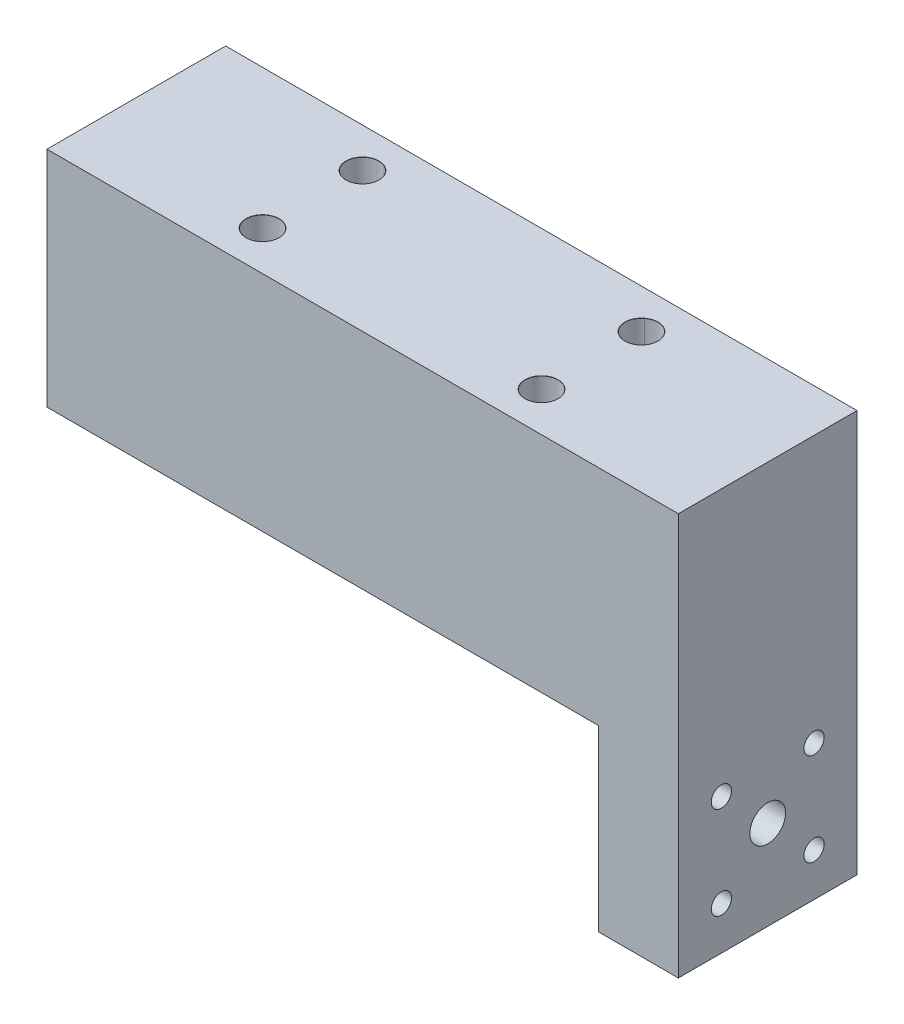
ISO-10303-21;
HEADER;
FILE_DESCRIPTION(('STEP AP214'),'2;1');
FILE_NAME('part.step','',(''),(''),'','','');
FILE_SCHEMA(('AUTOMOTIVE_DESIGN { 1 0 10303 214 1 1 1 1 }'));
ENDSEC;
DATA;
#1=APPLICATION_CONTEXT('core data for automotive mechanical design processes');
#2=APPLICATION_PROTOCOL_DEFINITION('international standard','automotive_design',2000,#1);
#3=PRODUCT_CONTEXT('',#1,'mechanical');
#4=PRODUCT('Part','Part','',(#3));
#5=PRODUCT_RELATED_PRODUCT_CATEGORY('part','',(#4));
#6=PRODUCT_DEFINITION_FORMATION('','',#4);
#7=PRODUCT_DEFINITION_CONTEXT('part definition',#1,'design');
#8=PRODUCT_DEFINITION('design','',#6,#7);
#9=PRODUCT_DEFINITION_SHAPE('','',#8);
#10=(LENGTH_UNIT() NAMED_UNIT(*) SI_UNIT(.MILLI.,.METRE.));
#11=(NAMED_UNIT(*) PLANE_ANGLE_UNIT() SI_UNIT($,.RADIAN.));
#12=(NAMED_UNIT(*) SI_UNIT($,.STERADIAN.) SOLID_ANGLE_UNIT());
#13=UNCERTAINTY_MEASURE_WITH_UNIT(LENGTH_MEASURE(1.E-05),#10,'distance_accuracy_value','');
#14=(GEOMETRIC_REPRESENTATION_CONTEXT(3) GLOBAL_UNCERTAINTY_ASSIGNED_CONTEXT((#13)) GLOBAL_UNIT_ASSIGNED_CONTEXT((#10,
#11,#12)) REPRESENTATION_CONTEXT('',''));
#15=CARTESIAN_POINT('',(0.,0.,0.));
#16=DIRECTION('',(0.,0.,1.));
#17=DIRECTION('',(1.,0.,0.));
#18=AXIS2_PLACEMENT_3D('',#15,#16,#17);
#19=CARTESIAN_POINT('',(15.7940014178421,-24.5903236205962,15.));
#20=DIRECTION('',(1.,0.,0.));
#21=DIRECTION('',(0.,1.,0.));
#22=AXIS2_PLACEMENT_3D('',#19,#20,#21);
#23=CYLINDRICAL_SURFACE('',#22,3.);
#24=CARTESIAN_POINT('',(45.7940014178421,-24.5903236205962,15.));
#25=DIRECTION('',(1.,0.,0.));
#26=DIRECTION('',(0.,1.,0.));
#27=AXIS2_PLACEMENT_3D('',#24,#25,#26);
#28=CIRCLE('',#27,3.);
#29=CARTESIAN_POINT('',(45.7940014178421,-21.5903236205962,15.));
#30=VERTEX_POINT('',#29);
#31=EDGE_CURVE('E270',#30,#30,#28,.T.);
#32=ORIENTED_EDGE('',*,*,#31,.T.);
#33=EDGE_LOOP('',(#32));
#34=FACE_BOUND('',#33,.T.);
#35=CARTESIAN_POINT('',(34.3940014178421,-24.5903236205962,15.));
#36=DIRECTION('',(-1.,0.,0.));
#37=DIRECTION('',(0.,0.,1.));
#38=AXIS2_PLACEMENT_3D('',#35,#36,#37);
#39=CIRCLE('',#38,3.);
#40=CARTESIAN_POINT('',(34.3940014178421,-24.5903236205962,18.));
#41=VERTEX_POINT('',#40);
#42=EDGE_CURVE('E169',#41,#41,#39,.F.);
#43=ORIENTED_EDGE('',*,*,#42,.F.);
#44=EDGE_LOOP('',(#43));
#45=FACE_BOUND('',#44,.T.);
#46=ADVANCED_FACE('F43',(#34,#45),#23,.F.);
#47=CARTESIAN_POINT('',(-60.2059985821579,27.9096763794038,30.));
#48=DIRECTION('',(1.,0.,0.));
#49=DIRECTION('',(0.,1.,0.));
#50=AXIS2_PLACEMENT_3D('',#47,#48,#49);
#51=PLANE('',#50);
#52=DIRECTION('',(0.,0.,-1.));
#53=VECTOR('',#52,1.);
#54=CARTESIAN_POINT('',(-60.2059985821578,-9.59032362059618,30.));
#55=LINE('',#54,#53);
#56=CARTESIAN_POINT('',(-60.2059985821578,-9.59032362059618,30.));
#57=VERTEX_POINT('',#56);
#58=CARTESIAN_POINT('',(-60.2059985821578,-9.59032362059618,0.));
#59=VERTEX_POINT('',#58);
#60=EDGE_CURVE('E262',#57,#59,#55,.T.);
#61=ORIENTED_EDGE('',*,*,#60,.F.);
#62=DIRECTION('',(0.,-1.,0.));
#63=VECTOR('',#62,1.);
#64=CARTESIAN_POINT('',(-60.2059985821579,27.9096763794038,30.));
#65=LINE('',#64,#63);
#66=CARTESIAN_POINT('',(-60.2059985821579,27.9096763794038,30.));
#67=VERTEX_POINT('',#66);
#68=EDGE_CURVE('E136',#67,#57,#65,.T.);
#69=ORIENTED_EDGE('',*,*,#68,.F.);
#70=DIRECTION('',(0.,0.,-1.));
#71=VECTOR('',#70,1.);
#72=CARTESIAN_POINT('',(-60.2059985821579,27.9096763794038,30.));
#73=LINE('',#72,#71);
#74=CARTESIAN_POINT('',(-60.2059985821579,27.9096763794038,0.));
#75=VERTEX_POINT('',#74);
#76=EDGE_CURVE('E135',#67,#75,#73,.T.);
#77=ORIENTED_EDGE('',*,*,#76,.T.);
#78=DIRECTION('',(0.,-1.,0.));
#79=VECTOR('',#78,1.);
#80=CARTESIAN_POINT('',(-60.2059985821579,27.9096763794038,0.));
#81=LINE('',#80,#79);
#82=EDGE_CURVE('E143',#75,#59,#81,.T.);
#83=ORIENTED_EDGE('',*,*,#82,.T.);
#84=EDGE_LOOP('',(#61,#69,#77,#83));
#85=FACE_BOUND('',#84,.T.);
#86=ADVANCED_FACE('F44',(#85),#51,.F.);
#87=CARTESIAN_POINT('',(-60.2059985821578,-39.5903236205962,30.));
#88=DIRECTION('',(0.,1.,0.));
#89=DIRECTION('',(0.,0.,1.));
#90=AXIS2_PLACEMENT_3D('',#87,#88,#89);
#91=PLANE('',#90);
#92=DIRECTION('',(1.,0.,0.));
#93=VECTOR('',#92,1.);
#94=CARTESIAN_POINT('',(-60.2059985821578,-39.5903236205962,30.));
#95=LINE('',#94,#93);
#96=CARTESIAN_POINT('',(32.3940014178421,-39.5903236205962,30.));
#97=VERTEX_POINT('',#96);
#98=CARTESIAN_POINT('',(45.7940014178422,-39.5903236205962,30.));
#99=VERTEX_POINT('',#98);
#100=EDGE_CURVE('E248',#97,#99,#95,.T.);
#101=ORIENTED_EDGE('',*,*,#100,.F.);
#102=DIRECTION('',(0.,0.,-1.));
#103=VECTOR('',#102,1.);
#104=CARTESIAN_POINT('',(32.3940014178421,-39.5903236205962,30.));
#105=LINE('',#104,#103);
#106=CARTESIAN_POINT('',(32.3940014178421,-39.5903236205962,0.));
#107=VERTEX_POINT('',#106);
#108=EDGE_CURVE('E153',#97,#107,#105,.T.);
#109=ORIENTED_EDGE('',*,*,#108,.T.);
#110=DIRECTION('',(1.,0.,0.));
#111=VECTOR('',#110,1.);
#112=CARTESIAN_POINT('',(-60.2059985821578,-39.5903236205962,0.));
#113=LINE('',#112,#111);
#114=CARTESIAN_POINT('',(45.7940014178422,-39.5903236205962,0.));
#115=VERTEX_POINT('',#114);
#116=EDGE_CURVE('E152',#107,#115,#113,.T.);
#117=ORIENTED_EDGE('',*,*,#116,.T.);
#118=DIRECTION('',(0.,0.,-1.));
#119=VECTOR('',#118,1.);
#120=CARTESIAN_POINT('',(45.7940014178422,-39.5903236205962,30.));
#121=LINE('',#120,#119);
#122=EDGE_CURVE('E164',#99,#115,#121,.T.);
#123=ORIENTED_EDGE('',*,*,#122,.F.);
#124=EDGE_LOOP('',(#101,#109,#117,#123));
#125=FACE_BOUND('',#124,.T.);
#126=ADVANCED_FACE('F213',(#125),#91,.F.);
#127=CARTESIAN_POINT('',(45.7940014178421,27.9096763794038,30.));
#128=DIRECTION('',(-1.,0.,0.));
#129=DIRECTION('',(0.,-1.,0.));
#130=AXIS2_PLACEMENT_3D('',#127,#128,#129);
#131=PLANE('',#130);
#132=CARTESIAN_POINT('',(45.7940014178422,-16.8121490275442,7.22182540694798));
#133=DIRECTION('',(-1.,0.,0.));
#134=DIRECTION('',(0.,0.,1.));
#135=AXIS2_PLACEMENT_3D('',#132,#133,#134);
#136=CIRCLE('',#135,1.7);
#137=CARTESIAN_POINT('',(45.7940014178422,-16.8121490275442,8.92182540694797));
#138=VERTEX_POINT('',#137);
#139=EDGE_CURVE('E296',#138,#138,#136,.T.);
#140=ORIENTED_EDGE('',*,*,#139,.T.);
#141=EDGE_LOOP('',(#140));
#142=FACE_BOUND('',#141,.T.);
#143=CARTESIAN_POINT('',(45.7940014178422,-16.8121490275442,22.7781745930521));
#144=DIRECTION('',(-1.,0.,0.));
#145=DIRECTION('',(0.,0.,1.));
#146=AXIS2_PLACEMENT_3D('',#143,#144,#145);
#147=CIRCLE('',#146,1.7);
#148=CARTESIAN_POINT('',(45.7940014178422,-16.8121490275442,24.4781745930521));
#149=VERTEX_POINT('',#148);
#150=EDGE_CURVE('E286',#149,#149,#147,.T.);
#151=ORIENTED_EDGE('',*,*,#150,.T.);
#152=EDGE_LOOP('',(#151));
#153=FACE_BOUND('',#152,.T.);
#154=CARTESIAN_POINT('',(45.7940014178422,-32.3684982136482,22.778174593052));
#155=DIRECTION('',(-1.,0.,0.));
#156=DIRECTION('',(0.,0.,1.));
#157=AXIS2_PLACEMENT_3D('',#154,#155,#156);
#158=CIRCLE('',#157,1.7);
#159=CARTESIAN_POINT('',(45.7940014178422,-32.3684982136482,24.478174593052));
#160=VERTEX_POINT('',#159);
#161=EDGE_CURVE('E279',#160,#160,#158,.T.);
#162=ORIENTED_EDGE('',*,*,#161,.T.);
#163=EDGE_LOOP('',(#162));
#164=FACE_BOUND('',#163,.T.);
#165=CARTESIAN_POINT('',(45.7940014178422,-32.3684982136484,7.22182540694819));
#166=DIRECTION('',(-1.,0.,0.));
#167=DIRECTION('',(0.,0.,1.));
#168=AXIS2_PLACEMENT_3D('',#165,#166,#167);
#169=CIRCLE('',#168,1.7);
#170=CARTESIAN_POINT('',(45.7940014178422,-32.3684982136484,8.92182540694819));
#171=VERTEX_POINT('',#170);
#172=EDGE_CURVE('E272',#171,#171,#169,.T.);
#173=ORIENTED_EDGE('',*,*,#172,.T.);
#174=EDGE_LOOP('',(#173));
#175=FACE_BOUND('',#174,.T.);
#176=ORIENTED_EDGE('',*,*,#31,.F.);
#177=EDGE_LOOP('',(#176));
#178=FACE_BOUND('',#177,.T.);
#179=DIRECTION('',(0.,1.,0.));
#180=VECTOR('',#179,1.);
#181=CARTESIAN_POINT('',(45.7940014178421,27.9096763794038,0.));
#182=LINE('',#181,#180);
#183=CARTESIAN_POINT('',(45.7940014178421,27.9096763794038,0.));
#184=VERTEX_POINT('',#183);
#185=EDGE_CURVE('E138',#115,#184,#182,.T.);
#186=ORIENTED_EDGE('',*,*,#185,.T.);
#187=DIRECTION('',(0.,0.,-1.));
#188=VECTOR('',#187,1.);
#189=CARTESIAN_POINT('',(45.7940014178421,27.9096763794038,30.));
#190=LINE('',#189,#188);
#191=CARTESIAN_POINT('',(45.7940014178421,27.9096763794038,30.));
#192=VERTEX_POINT('',#191);
#193=EDGE_CURVE('E134',#192,#184,#190,.T.);
#194=ORIENTED_EDGE('',*,*,#193,.F.);
#195=DIRECTION('',(0.,1.,0.));
#196=VECTOR('',#195,1.);
#197=CARTESIAN_POINT('',(45.7940014178421,27.9096763794038,30.));
#198=LINE('',#197,#196);
#199=EDGE_CURVE('E257',#99,#192,#198,.T.);
#200=ORIENTED_EDGE('',*,*,#199,.F.);
#201=ORIENTED_EDGE('',*,*,#122,.T.);
#202=EDGE_LOOP('',(#186,#194,#200,#201));
#203=FACE_BOUND('',#202,.T.);
#204=ADVANCED_FACE('F208',(#142,#153,#164,#175,#178,#203),#131,.F.);
#205=CARTESIAN_POINT('',(-60.2059985821579,27.9096763794038,30.));
#206=DIRECTION('',(0.,-1.,0.));
#207=DIRECTION('',(0.,0.,-1.));
#208=AXIS2_PLACEMENT_3D('',#205,#206,#207);
#209=PLANE('',#208);
#210=CARTESIAN_POINT('',(-30.6242090565358,27.9096763794038,6.6141635759869));
#211=DIRECTION('',(0.,1.,0.));
#212=DIRECTION('',(0.,0.,1.));
#213=AXIS2_PLACEMENT_3D('',#210,#211,#212);
#214=CIRCLE('',#213,2.775);
#215=CARTESIAN_POINT('',(-31.7195661816328,27.9096763794038,9.16383370533685));
#216=VERTEX_POINT('',#215);
#217=CARTESIAN_POINT('',(-29.5288811747591,27.9096763794038,4.06448088368921));
#218=VERTEX_POINT('',#217);
#219=EDGE_CURVE('E607',#216,#218,#214,.T.);
#220=ORIENTED_EDGE('',*,*,#219,.F.);
#221=CARTESIAN_POINT('',(-30.6242382992522,27.9096763794038,6.61415101329855));
#222=DIRECTION('',(0.,1.,0.));
#223=DIRECTION('',(0.,0.,1.));
#224=AXIS2_PLACEMENT_3D('',#221,#222,#223);
#225=CIRCLE('',#224,2.775);
#226=EDGE_CURVE('E59',#218,#216,#225,.T.);
#227=ORIENTED_EDGE('',*,*,#226,.F.);
#228=EDGE_LOOP('',(#220,#227));
#229=FACE_BOUND('',#228,.T.);
#230=CARTESIAN_POINT('',(16.2122227726959,27.9096763794038,6.6141620925815));
#231=DIRECTION('',(0.,1.,0.));
#232=DIRECTION('',(0.,0.,1.));
#233=AXIS2_PLACEMENT_3D('',#230,#231,#232);
#234=CIRCLE('',#233,2.775);
#235=CARTESIAN_POINT('',(14.5385075322435,27.9096763794038,4.40072533182294));
#236=VERTEX_POINT('',#235);
#237=CARTESIAN_POINT('',(17.8859515264885,27.9096763794038,8.82758863501017));
#238=VERTEX_POINT('',#237);
#239=EDGE_CURVE('E200',#236,#238,#234,.T.);
#240=ORIENTED_EDGE('',*,*,#239,.F.);
#241=CARTESIAN_POINT('',(14.5385075322435,27.9096763794038,4.40072533182294));
#242=CARTESIAN_POINT('',(14.7562897477303,27.9096763794038,4.23604475663374));
#243=CARTESIAN_POINT('',(15.0024868107985,27.9096763794038,4.11672695901462));
#244=CARTESIAN_POINT('',(15.1246709466571,27.9096763794038,4.0575112160932));
#245=CARTESIAN_POINT('',(15.2531030303617,27.9096763794038,4.01017637552189));
#246=CARTESIAN_POINT('',(15.380502982951,27.9096763794038,3.9632219364856));
#247=CARTESIAN_POINT('',(15.5129562633657,27.9096763794038,3.92870359695053));
#248=CARTESIAN_POINT('',(15.6443450967281,27.9096763794038,3.8944626604715));
#249=CARTESIAN_POINT('',(15.7795439714078,27.9096763794038,3.8730932537429));
#250=CARTESIAN_POINT('',(15.9136563343446,27.9096763794038,3.85189558003651));
#251=CARTESIAN_POINT('',(16.0502987591571,27.9096763794038,3.84388090598367));
#252=CARTESIAN_POINT('',(16.185843071284,27.9096763794038,3.83593064102823));
#253=CARTESIAN_POINT('',(16.3226130998716,27.9096763794038,3.84134788564343));
#254=CARTESIAN_POINT('',(16.4582839902984,27.9096763794038,3.84672159513369));
#255=CARTESIAN_POINT('',(16.5938644474031,27.9096763794038,3.86551858718748));
#256=CARTESIAN_POINT('',(16.7283553262193,27.9096763794038,3.88416451916324));
#257=CARTESIAN_POINT('',(16.8614404928488,27.9096763794038,3.91616023264291));
#258=CARTESIAN_POINT('',(16.9934561343349,27.9096763794038,3.94789881588849));
#259=CARTESIAN_POINT('',(17.1227643226115,27.9096763794038,3.99278511338637));
#260=CARTESIAN_POINT('',(17.2510333390368,27.9096763794038,4.03731068680721));
#261=CARTESIAN_POINT('',(17.3753192355827,27.9096763794038,4.09465528706305));
#262=CARTESIAN_POINT('',(17.4986063214085,27.9096763794038,4.15153904338517));
#263=CARTESIAN_POINT('',(17.616672980444,27.9096763794038,4.2207896844025));
#264=CARTESIAN_POINT('',(17.7337908090184,27.9096763794038,4.28948379982497));
#265=CARTESIAN_POINT('',(17.8445011796684,27.9096763794038,4.3699735574887));
#266=CARTESIAN_POINT('',(17.9543218379078,27.9096763794038,4.4498164675636));
#267=CARTESIAN_POINT('',(18.0566097146325,27.9096763794038,4.54077017849202));
#268=CARTESIAN_POINT('',(18.1580755654546,27.9096763794038,4.63099294936458));
#269=CARTESIAN_POINT('',(18.2509558562614,27.9096763794038,4.7315346761973));
#270=CARTESIAN_POINT('',(18.3430897242488,27.9096763794038,4.83126840987485));
#271=CARTESIAN_POINT('',(18.4256679377021,27.9096763794038,4.94042987707437));
#272=CARTESIAN_POINT('',(18.5075825199002,27.9096763794038,5.04871407945471));
#273=CARTESIAN_POINT('',(18.5790633795684,27.9096763794038,5.16544399833217));
#274=CARTESIAN_POINT('',(18.649969790711,27.9096763794038,5.2812358293059));
#275=CARTESIAN_POINT('',(18.7096648941637,27.9096763794038,5.40441002256201));
#276=CARTESIAN_POINT('',(18.7688802640961,27.9096763794038,5.52659433916277));
#277=CARTESIAN_POINT('',(18.8162147126236,27.9096763794038,5.65502656738088));
#278=CARTESIAN_POINT('',(18.8631687627568,27.9096763794038,5.78242666329515));
#279=CARTESIAN_POINT('',(18.8976866979654,27.9096763794038,5.91488004908792));
#280=CARTESIAN_POINT('',(18.931927233365,27.9096763794038,6.04626898697278));
#281=CARTESIAN_POINT('',(18.9532962273858,27.9096763794038,6.18146792688514));
#282=CARTESIAN_POINT('',(18.9744934917013,27.9096763794038,6.31558035453136));
#283=CARTESIAN_POINT('',(18.9825077486375,27.9096763794038,6.45222280380697));
#284=CARTESIAN_POINT('',(18.9904575998289,27.9096763794038,6.58776714020686));
#285=CARTESIAN_POINT('',(18.9850399377097,27.9096763794038,6.72453715225247));
#286=CARTESIAN_POINT('',(18.9796658140707,27.9096763794038,6.86020802626963));
#287=CARTESIAN_POINT('',(18.9608684081426,27.9096763794038,6.99578842599912));
#288=CARTESIAN_POINT('',(18.9422220656198,27.9096763794038,7.13027924789243));
#289=CARTESIAN_POINT('',(18.9102259458835,27.9096763794038,7.26336431685465));
#290=CARTESIAN_POINT('',(18.8784869596473,27.9096763794038,7.39537986145301));
#291=CARTESIAN_POINT('',(18.833600267422,27.9096763794038,7.52468791271065));
#292=CARTESIAN_POINT('',(18.7890743024457,27.9096763794038,7.6529567932184));
#293=CARTESIAN_POINT('',(18.7317293227954,27.9096763794038,7.77724251471126));
#294=CARTESIAN_POINT('',(18.6748451901299,27.9096763794038,7.90052942688636));
#295=CARTESIAN_POINT('',(18.6055941886989,27.9096763794038,8.01859587453304));
#296=CARTESIAN_POINT('',(18.5368997157628,27.9096763794038,8.13571349341135));
#297=CARTESIAN_POINT('',(18.456409620144,27.9096763794038,8.24642361835688));
#298=CARTESIAN_POINT('',(18.3765663748266,27.9096763794038,8.35624403287101));
#299=CARTESIAN_POINT('',(18.2856123516579,27.9096763794038,8.45853163194546));
#300=CARTESIAN_POINT('',(18.1953892710578,27.9096763794038,8.55999720734469));
#301=CARTESIAN_POINT('',(18.0948472606916,27.9096763794038,8.65287719124484));
#302=CARTESIAN_POINT('',(17.9949103507752,27.9096763794038,8.74519818771437));
#303=CARTESIAN_POINT('',(17.8859515264885,27.9096763794038,8.82758863501017));
#304=B_SPLINE_CURVE_WITH_KNOTS('',2,(#241,#242,#243,#244,#245,#246,#247,#248,#249,#250,#251,
#252,#253,#254,#255,#256,#257,#258,#259,#260,#261,#262,#263,#264,#265,#266,#267,#268,#269,#270,
#271,#272,#273,#274,#275,#276,#277,#278,#279,#280,#281,#282,#283,#284,#285,#286,#287,#288,#289,
#290,#291,#292,#293,#294,#295,#296,#297,#298,#299,#300,#301,#302,#303),.UNSPECIFIED.,.F.,.F.,(3,
2,2,2,2,2,2,2,2,2,2,2,2,2,2,2,2,2,2,2,2,2,2,2,2,2,2,2,2,2,2,3),(0.,0.0625,0.09375,0.125,0.15625,
0.1875,0.21875,0.25,0.28125,0.3125,0.34375,0.375,0.40625,0.4375,0.46875,0.5,0.53125,0.5625,
0.59375,0.625,0.65625,0.6875,0.71875,0.75,0.78125,0.8125,0.84375,0.875,0.90625,0.9375,0.96875,
1.),.UNSPECIFIED.);
#305=EDGE_CURVE('E70',#236,#238,#304,.T.);
#306=ORIENTED_EDGE('',*,*,#305,.T.);
#307=EDGE_LOOP('',(#240,#306));
#308=FACE_BOUND('',#307,.T.);
#309=CARTESIAN_POINT('',(16.212229799726,27.9096763794038,23.3858441283466));
#310=DIRECTION('',(0.,1.,0.));
#311=DIRECTION('',(0.,0.,1.));
#312=AXIS2_PLACEMENT_3D('',#309,#310,#311);
#313=CIRCLE('',#312,2.775);
#314=CARTESIAN_POINT('',(16.212229799726,27.9096763794038,26.1608441283466));
#315=VERTEX_POINT('',#314);
#316=EDGE_CURVE('E190',#315,#315,#313,.T.);
#317=ORIENTED_EDGE('',*,*,#316,.F.);
#318=EDGE_LOOP('',(#317));
#319=FACE_BOUND('',#318,.T.);
#320=CARTESIAN_POINT('',(-30.6242230610333,27.9096763794038,23.3858497429351));
#321=DIRECTION('',(0.,1.,0.));
#322=DIRECTION('',(0.,0.,1.));
#323=AXIS2_PLACEMENT_3D('',#320,#321,#322);
#324=CIRCLE('',#323,2.775);
#325=CARTESIAN_POINT('',(-30.6242230610333,27.9096763794038,26.1608497429351));
#326=VERTEX_POINT('',#325);
#327=EDGE_CURVE('E185',#326,#326,#324,.T.);
#328=ORIENTED_EDGE('',*,*,#327,.F.);
#329=EDGE_LOOP('',(#328));
#330=FACE_BOUND('',#329,.T.);
#331=DIRECTION('',(-1.,0.,0.));
#332=VECTOR('',#331,1.);
#333=CARTESIAN_POINT('',(-60.2059985821579,27.9096763794038,0.));
#334=LINE('',#333,#332);
#335=EDGE_CURVE('E127',#184,#75,#334,.T.);
#336=ORIENTED_EDGE('',*,*,#335,.T.);
#337=ORIENTED_EDGE('',*,*,#76,.F.);
#338=DIRECTION('',(-1.,0.,0.));
#339=VECTOR('',#338,1.);
#340=CARTESIAN_POINT('',(-60.2059985821579,27.9096763794038,30.));
#341=LINE('',#340,#339);
#342=EDGE_CURVE('E150',#192,#67,#341,.T.);
#343=ORIENTED_EDGE('',*,*,#342,.F.);
#344=ORIENTED_EDGE('',*,*,#193,.T.);
#345=EDGE_LOOP('',(#336,#337,#343,#344));
#346=FACE_BOUND('',#345,.T.);
#347=ADVANCED_FACE('F129',(#229,#308,#319,#330,#346),#209,.F.);
#348=CARTESIAN_POINT('',(0.,0.,30.));
#349=DIRECTION('',(0.,0.,1.));
#350=DIRECTION('',(1.,0.,0.));
#351=AXIS2_PLACEMENT_3D('',#348,#349,#350);
#352=PLANE('',#351);
#353=DIRECTION('',(0.,1.,0.));
#354=VECTOR('',#353,1.);
#355=CARTESIAN_POINT('',(32.3940014178421,-39.5903236205962,30.));
#356=LINE('',#355,#354);
#357=CARTESIAN_POINT('',(32.3940014178421,-9.59032362059618,30.));
#358=VERTEX_POINT('',#357);
#359=EDGE_CURVE('E247',#97,#358,#356,.T.);
#360=ORIENTED_EDGE('',*,*,#359,.F.);
#361=ORIENTED_EDGE('',*,*,#100,.T.);
#362=ORIENTED_EDGE('',*,*,#199,.T.);
#363=ORIENTED_EDGE('',*,*,#342,.T.);
#364=ORIENTED_EDGE('',*,*,#68,.T.);
#365=DIRECTION('',(-1.,0.,0.));
#366=VECTOR('',#365,1.);
#367=CARTESIAN_POINT('',(-60.2059985821578,-9.59032362059618,30.));
#368=LINE('',#367,#366);
#369=EDGE_CURVE('E252',#358,#57,#368,.T.);
#370=ORIENTED_EDGE('',*,*,#369,.F.);
#371=EDGE_LOOP('',(#360,#361,#362,#363,#364,#370));
#372=FACE_BOUND('',#371,.T.);
#373=ADVANCED_FACE('F209',(#372),#352,.T.);
#374=CARTESIAN_POINT('',(0.,0.,0.));
#375=DIRECTION('',(0.,0.,1.));
#376=DIRECTION('',(1.,0.,0.));
#377=AXIS2_PLACEMENT_3D('',#374,#375,#376);
#378=PLANE('',#377);
#379=DIRECTION('',(0.,1.,0.));
#380=VECTOR('',#379,1.);
#381=CARTESIAN_POINT('',(32.3940014178421,-39.5903236205962,0.));
#382=LINE('',#381,#380);
#383=CARTESIAN_POINT('',(32.3940014178421,-9.59032362059618,0.));
#384=VERTEX_POINT('',#383);
#385=EDGE_CURVE('E267',#107,#384,#382,.T.);
#386=ORIENTED_EDGE('',*,*,#385,.T.);
#387=DIRECTION('',(-1.,0.,0.));
#388=VECTOR('',#387,1.);
#389=CARTESIAN_POINT('',(-60.2059985821578,-9.59032362059618,0.));
#390=LINE('',#389,#388);
#391=EDGE_CURVE('E155',#384,#59,#390,.T.);
#392=ORIENTED_EDGE('',*,*,#391,.T.);
#393=ORIENTED_EDGE('',*,*,#82,.F.);
#394=ORIENTED_EDGE('',*,*,#335,.F.);
#395=ORIENTED_EDGE('',*,*,#185,.F.);
#396=ORIENTED_EDGE('',*,*,#116,.F.);
#397=EDGE_LOOP('',(#386,#392,#393,#394,#395,#396));
#398=FACE_BOUND('',#397,.T.);
#399=ADVANCED_FACE('F151',(#398),#378,.F.);
#400=CARTESIAN_POINT('',(32.3940014178421,-39.5903236205962,30.));
#401=DIRECTION('',(-1.,0.,0.));
#402=DIRECTION('',(0.,0.,1.));
#403=AXIS2_PLACEMENT_3D('',#400,#401,#402);
#404=PLANE('',#403);
#405=CARTESIAN_POINT('',(32.3940014178421,-24.5903236205962,15.));
#406=DIRECTION('',(-1.,0.,0.));
#407=DIRECTION('',(0.,0.,1.));
#408=AXIS2_PLACEMENT_3D('',#405,#406,#407);
#409=CIRCLE('',#408,9.);
#410=CARTESIAN_POINT('',(32.3940014178421,-24.5903236205962,24.));
#411=VERTEX_POINT('',#410);
#412=EDGE_CURVE('E180',#411,#411,#409,.T.);
#413=ORIENTED_EDGE('',*,*,#412,.F.);
#414=EDGE_LOOP('',(#413));
#415=FACE_BOUND('',#414,.T.);
#416=CARTESIAN_POINT('',(32.3940014178421,-16.8121490275442,7.22182540694798));
#417=DIRECTION('',(-1.,0.,0.));
#418=DIRECTION('',(0.,0.,1.));
#419=AXIS2_PLACEMENT_3D('',#416,#417,#418);
#420=CIRCLE('',#419,1.725);
#421=CARTESIAN_POINT('',(32.3940014178421,-16.8121490275442,8.94682540694798));
#422=VERTEX_POINT('',#421);
#423=EDGE_CURVE('E175',#422,#422,#420,.T.);
#424=ORIENTED_EDGE('',*,*,#423,.F.);
#425=EDGE_LOOP('',(#424));
#426=FACE_BOUND('',#425,.T.);
#427=CARTESIAN_POINT('',(32.3940014178421,-16.8121490275442,22.7781745930521));
#428=DIRECTION('',(-1.,0.,0.));
#429=DIRECTION('',(0.,0.,1.));
#430=AXIS2_PLACEMENT_3D('',#427,#428,#429);
#431=CIRCLE('',#430,1.725);
#432=CARTESIAN_POINT('',(32.3940014178421,-16.8121490275442,24.5031745930521));
#433=VERTEX_POINT('',#432);
#434=EDGE_CURVE('E294',#433,#433,#431,.T.);
#435=ORIENTED_EDGE('',*,*,#434,.F.);
#436=EDGE_LOOP('',(#435));
#437=FACE_BOUND('',#436,.T.);
#438=CARTESIAN_POINT('',(32.3940014178421,-32.3684982136482,22.778174593052));
#439=DIRECTION('',(-1.,0.,0.));
#440=DIRECTION('',(0.,0.,1.));
#441=AXIS2_PLACEMENT_3D('',#438,#439,#440);
#442=CIRCLE('',#441,1.725);
#443=CARTESIAN_POINT('',(32.3940014178421,-32.3684982136482,24.503174593052));
#444=VERTEX_POINT('',#443);
#445=EDGE_CURVE('E287',#444,#444,#442,.T.);
#446=ORIENTED_EDGE('',*,*,#445,.F.);
#447=EDGE_LOOP('',(#446));
#448=FACE_BOUND('',#447,.T.);
#449=CARTESIAN_POINT('',(32.3940014178421,-32.3684982136484,7.22182540694819));
#450=DIRECTION('',(-1.,0.,0.));
#451=DIRECTION('',(0.,0.,1.));
#452=AXIS2_PLACEMENT_3D('',#449,#450,#451);
#453=CIRCLE('',#452,1.725);
#454=CARTESIAN_POINT('',(32.3940014178421,-32.3684982136484,8.94682540694819));
#455=VERTEX_POINT('',#454);
#456=EDGE_CURVE('E280',#455,#455,#453,.T.);
#457=ORIENTED_EDGE('',*,*,#456,.F.);
#458=EDGE_LOOP('',(#457));
#459=FACE_BOUND('',#458,.T.);
#460=ORIENTED_EDGE('',*,*,#385,.F.);
#461=ORIENTED_EDGE('',*,*,#108,.F.);
#462=ORIENTED_EDGE('',*,*,#359,.T.);
#463=DIRECTION('',(0.,0.,-1.));
#464=VECTOR('',#463,1.);
#465=CARTESIAN_POINT('',(32.3940014178421,-9.59032362059618,30.));
#466=LINE('',#465,#464);
#467=EDGE_CURVE('E160',#358,#384,#466,.T.);
#468=ORIENTED_EDGE('',*,*,#467,.T.);
#469=EDGE_LOOP('',(#460,#461,#462,#468));
#470=FACE_BOUND('',#469,.T.);
#471=ADVANCED_FACE('F237',(#415,#426,#437,#448,#459,#470),#404,.T.);
#472=CARTESIAN_POINT('',(-60.2059985821578,-9.59032362059618,30.));
#473=DIRECTION('',(0.,-1.,0.));
#474=DIRECTION('',(0.,0.,-1.));
#475=AXIS2_PLACEMENT_3D('',#472,#473,#474);
#476=PLANE('',#475);
#477=CARTESIAN_POINT('',(-30.6242382992522,-9.59032362059617,6.61415101329855));
#478=DIRECTION('',(0.,-1.,0.));
#479=DIRECTION('',(0.,0.,-1.));
#480=AXIS2_PLACEMENT_3D('',#477,#478,#479);
#481=CIRCLE('',#480,2.75);
#482=CARTESIAN_POINT('',(-31.7096982308405,-9.59032362059618,9.14086364771432));
#483=VERTEX_POINT('',#482);
#484=CARTESIAN_POINT('',(-29.5387491249475,-9.59032362059618,4.08745094157114));
#485=VERTEX_POINT('',#484);
#486=EDGE_CURVE('E602',#483,#485,#481,.T.);
#487=ORIENTED_EDGE('',*,*,#486,.F.);
#488=CARTESIAN_POINT('',(-30.6242090565358,-9.59032362059618,6.6141635759869));
#489=DIRECTION('',(0.,-1.,0.));
#490=DIRECTION('',(0.,0.,-1.));
#491=AXIS2_PLACEMENT_3D('',#488,#489,#490);
#492=CIRCLE('',#491,2.75);
#493=EDGE_CURVE('E374',#485,#483,#492,.T.);
#494=ORIENTED_EDGE('',*,*,#493,.F.);
#495=EDGE_LOOP('',(#487,#494));
#496=FACE_BOUND('',#495,.T.);
#497=CARTESIAN_POINT('',(16.2122362860981,-9.59032362059618,6.61415187420469));
#498=DIRECTION('',(0.,1.,0.));
#499=DIRECTION('',(0.,0.,1.));
#500=AXIS2_PLACEMENT_3D('',#497,#498,#499);
#501=CIRCLE('',#500,2.75);
#502=CARTESIAN_POINT('',(14.5535861088231,-9.59032362059618,4.42066615749134));
#503=VERTEX_POINT('',#502);
#504=CARTESIAN_POINT('',(17.8708729499709,-9.59032362059618,8.80764780929485));
#505=VERTEX_POINT('',#504);
#506=EDGE_CURVE('E83',#503,#505,#501,.F.);
#507=ORIENTED_EDGE('',*,*,#506,.F.);
#508=CARTESIAN_POINT('',(16.2122227726959,-9.59032362059618,6.6141620925815));
#509=DIRECTION('',(0.,-1.,0.));
#510=DIRECTION('',(0.,0.,-1.));
#511=AXIS2_PLACEMENT_3D('',#508,#509,#510);
#512=CIRCLE('',#511,2.75);
#513=EDGE_CURVE('E183',#505,#503,#512,.T.);
#514=ORIENTED_EDGE('',*,*,#513,.F.);
#515=EDGE_LOOP('',(#507,#514));
#516=FACE_BOUND('',#515,.T.);
#517=CARTESIAN_POINT('',(16.212229799726,-9.59032362059618,23.3858441283466));
#518=DIRECTION('',(0.,-1.,0.));
#519=DIRECTION('',(0.,0.,-1.));
#520=AXIS2_PLACEMENT_3D('',#517,#518,#519);
#521=CIRCLE('',#520,2.75);
#522=CARTESIAN_POINT('',(16.212229799726,-9.59032362059618,20.6358441283466));
#523=VERTEX_POINT('',#522);
#524=EDGE_CURVE('E177',#523,#523,#521,.T.);
#525=ORIENTED_EDGE('',*,*,#524,.F.);
#526=EDGE_LOOP('',(#525));
#527=FACE_BOUND('',#526,.T.);
#528=CARTESIAN_POINT('',(-30.6242230610333,-9.59032362059618,23.3858497429351));
#529=DIRECTION('',(0.,-1.,0.));
#530=DIRECTION('',(0.,0.,-1.));
#531=AXIS2_PLACEMENT_3D('',#528,#529,#530);
#532=CIRCLE('',#531,2.75);
#533=CARTESIAN_POINT('',(-30.6242230610333,-9.59032362059618,20.6358497429351));
#534=VERTEX_POINT('',#533);
#535=EDGE_CURVE('E172',#534,#534,#532,.T.);
#536=ORIENTED_EDGE('',*,*,#535,.F.);
#537=EDGE_LOOP('',(#536));
#538=FACE_BOUND('',#537,.T.);
#539=ORIENTED_EDGE('',*,*,#391,.F.);
#540=ORIENTED_EDGE('',*,*,#467,.F.);
#541=ORIENTED_EDGE('',*,*,#369,.T.);
#542=ORIENTED_EDGE('',*,*,#60,.T.);
#543=EDGE_LOOP('',(#539,#540,#541,#542));
#544=FACE_BOUND('',#543,.T.);
#545=ADVANCED_FACE('F236',(#496,#516,#527,#538,#544),#476,.T.);
#546=CARTESIAN_POINT('',(32.3940014178421,-32.3684982136484,7.22182540694819));
#547=DIRECTION('',(-1.,0.,0.));
#548=DIRECTION('',(0.,0.,1.));
#549=AXIS2_PLACEMENT_3D('',#546,#547,#548);
#550=CYLINDRICAL_SURFACE('',#549,1.7);
#551=ORIENTED_EDGE('',*,*,#172,.F.);
#552=EDGE_LOOP('',(#551));
#553=FACE_BOUND('',#552,.T.);
#554=CARTESIAN_POINT('',(32.4190014178421,-32.3684982136484,7.22182540694819));
#555=DIRECTION('',(-1.,0.,0.));
#556=DIRECTION('',(0.,0.,1.));
#557=AXIS2_PLACEMENT_3D('',#554,#555,#556);
#558=CIRCLE('',#557,1.7);
#559=CARTESIAN_POINT('',(32.4190014178421,-32.3684982136484,8.92182540694819));
#560=VERTEX_POINT('',#559);
#561=EDGE_CURVE('E274',#560,#560,#558,.T.);
#562=ORIENTED_EDGE('',*,*,#561,.T.);
#563=EDGE_LOOP('',(#562));
#564=FACE_BOUND('',#563,.T.);
#565=ADVANCED_FACE('F234',(#553,#564),#550,.F.);
#566=CARTESIAN_POINT('',(32.3940014178421,-32.3684982136484,7.22182540694819));
#567=DIRECTION('',(-1.,0.,0.));
#568=DIRECTION('',(0.,0.,1.));
#569=AXIS2_PLACEMENT_3D('',#566,#567,#568);
#570=CONICAL_SURFACE('',#569,1.725,0.785398163397448);
#571=ORIENTED_EDGE('',*,*,#561,.F.);
#572=EDGE_LOOP('',(#571));
#573=FACE_BOUND('',#572,.T.);
#574=ORIENTED_EDGE('',*,*,#456,.T.);
#575=EDGE_LOOP('',(#574));
#576=FACE_BOUND('',#575,.T.);
#577=ADVANCED_FACE('F439',(#573,#576),#570,.F.);
#578=CARTESIAN_POINT('',(32.3940014178421,-32.3684982136482,22.778174593052));
#579=DIRECTION('',(-1.,0.,0.));
#580=DIRECTION('',(0.,0.,1.));
#581=AXIS2_PLACEMENT_3D('',#578,#579,#580);
#582=CYLINDRICAL_SURFACE('',#581,1.7);
#583=ORIENTED_EDGE('',*,*,#161,.F.);
#584=EDGE_LOOP('',(#583));
#585=FACE_BOUND('',#584,.T.);
#586=CARTESIAN_POINT('',(32.4190014178421,-32.3684982136482,22.778174593052));
#587=DIRECTION('',(-1.,0.,0.));
#588=DIRECTION('',(0.,0.,1.));
#589=AXIS2_PLACEMENT_3D('',#586,#587,#588);
#590=CIRCLE('',#589,1.7);
#591=CARTESIAN_POINT('',(32.4190014178421,-32.3684982136482,24.478174593052));
#592=VERTEX_POINT('',#591);
#593=EDGE_CURVE('E282',#592,#592,#590,.T.);
#594=ORIENTED_EDGE('',*,*,#593,.T.);
#595=EDGE_LOOP('',(#594));
#596=FACE_BOUND('',#595,.T.);
#597=ADVANCED_FACE('F440',(#585,#596),#582,.F.);
#598=CARTESIAN_POINT('',(32.3940014178421,-32.3684982136482,22.778174593052));
#599=DIRECTION('',(-1.,0.,0.));
#600=DIRECTION('',(0.,0.,1.));
#601=AXIS2_PLACEMENT_3D('',#598,#599,#600);
#602=CONICAL_SURFACE('',#601,1.725,0.785398163397448);
#603=ORIENTED_EDGE('',*,*,#593,.F.);
#604=EDGE_LOOP('',(#603));
#605=FACE_BOUND('',#604,.T.);
#606=ORIENTED_EDGE('',*,*,#445,.T.);
#607=EDGE_LOOP('',(#606));
#608=FACE_BOUND('',#607,.T.);
#609=ADVANCED_FACE('F433',(#605,#608),#602,.F.);
#610=CARTESIAN_POINT('',(32.3940014178421,-16.8121490275442,22.7781745930521));
#611=DIRECTION('',(-1.,0.,0.));
#612=DIRECTION('',(0.,0.,1.));
#613=AXIS2_PLACEMENT_3D('',#610,#611,#612);
#614=CYLINDRICAL_SURFACE('',#613,1.7);
#615=ORIENTED_EDGE('',*,*,#150,.F.);
#616=EDGE_LOOP('',(#615));
#617=FACE_BOUND('',#616,.T.);
#618=CARTESIAN_POINT('',(32.4190014178421,-16.8121490275442,22.7781745930521));
#619=DIRECTION('',(-1.,0.,0.));
#620=DIRECTION('',(0.,0.,1.));
#621=AXIS2_PLACEMENT_3D('',#618,#619,#620);
#622=CIRCLE('',#621,1.7);
#623=CARTESIAN_POINT('',(32.4190014178421,-16.8121490275442,24.4781745930521));
#624=VERTEX_POINT('',#623);
#625=EDGE_CURVE('E292',#624,#624,#622,.T.);
#626=ORIENTED_EDGE('',*,*,#625,.T.);
#627=EDGE_LOOP('',(#626));
#628=FACE_BOUND('',#627,.T.);
#629=ADVANCED_FACE('F429',(#617,#628),#614,.F.);
#630=CARTESIAN_POINT('',(32.3940014178421,-16.8121490275442,22.7781745930521));
#631=DIRECTION('',(-1.,0.,0.));
#632=DIRECTION('',(0.,0.,1.));
#633=AXIS2_PLACEMENT_3D('',#630,#631,#632);
#634=CONICAL_SURFACE('',#633,1.725,0.785398163397414);
#635=ORIENTED_EDGE('',*,*,#625,.F.);
#636=EDGE_LOOP('',(#635));
#637=FACE_BOUND('',#636,.T.);
#638=ORIENTED_EDGE('',*,*,#434,.T.);
#639=EDGE_LOOP('',(#638));
#640=FACE_BOUND('',#639,.T.);
#641=ADVANCED_FACE('F424',(#637,#640),#634,.F.);
#642=CARTESIAN_POINT('',(32.3940014178421,-16.8121490275442,7.22182540694798));
#643=DIRECTION('',(-1.,0.,0.));
#644=DIRECTION('',(0.,0.,1.));
#645=AXIS2_PLACEMENT_3D('',#642,#643,#644);
#646=CYLINDRICAL_SURFACE('',#645,1.7);
#647=ORIENTED_EDGE('',*,*,#139,.F.);
#648=EDGE_LOOP('',(#647));
#649=FACE_BOUND('',#648,.T.);
#650=CARTESIAN_POINT('',(32.4190014178421,-16.8121490275442,7.22182540694798));
#651=DIRECTION('',(-1.,0.,0.));
#652=DIRECTION('',(0.,0.,1.));
#653=AXIS2_PLACEMENT_3D('',#650,#651,#652);
#654=CIRCLE('',#653,1.7);
#655=CARTESIAN_POINT('',(32.4190014178421,-16.8121490275442,8.92182540694797));
#656=VERTEX_POINT('',#655);
#657=EDGE_CURVE('E301',#656,#656,#654,.T.);
#658=ORIENTED_EDGE('',*,*,#657,.T.);
#659=EDGE_LOOP('',(#658));
#660=FACE_BOUND('',#659,.T.);
#661=ADVANCED_FACE('F423',(#649,#660),#646,.F.);
#662=CARTESIAN_POINT('',(32.3940014178421,-16.8121490275442,7.22182540694798));
#663=DIRECTION('',(-1.,0.,0.));
#664=DIRECTION('',(0.,0.,1.));
#665=AXIS2_PLACEMENT_3D('',#662,#663,#664);
#666=CONICAL_SURFACE('',#665,1.725,0.785398163397414);
#667=ORIENTED_EDGE('',*,*,#657,.F.);
#668=EDGE_LOOP('',(#667));
#669=FACE_BOUND('',#668,.T.);
#670=ORIENTED_EDGE('',*,*,#423,.T.);
#671=EDGE_LOOP('',(#670));
#672=FACE_BOUND('',#671,.T.);
#673=ADVANCED_FACE('F414',(#669,#672),#666,.F.);
#674=CARTESIAN_POINT('',(34.3940014178421,-24.5903236205962,15.));
#675=DIRECTION('',(-1.,0.,0.));
#676=DIRECTION('',(0.,0.,1.));
#677=AXIS2_PLACEMENT_3D('',#674,#675,#676);
#678=PLANE('',#677);
#679=CARTESIAN_POINT('',(34.3940014178421,-24.5903236205962,15.));
#680=DIRECTION('',(-1.,0.,0.));
#681=DIRECTION('',(0.,0.,1.));
#682=AXIS2_PLACEMENT_3D('',#679,#680,#681);
#683=CIRCLE('',#682,9.);
#684=CARTESIAN_POINT('',(34.3940014178421,-24.5903236205962,24.));
#685=VERTEX_POINT('',#684);
#686=EDGE_CURVE('E173',#685,#685,#683,.T.);
#687=ORIENTED_EDGE('',*,*,#686,.T.);
#688=EDGE_LOOP('',(#687));
#689=FACE_BOUND('',#688,.T.);
#690=ORIENTED_EDGE('',*,*,#42,.T.);
#691=EDGE_LOOP('',(#690));
#692=FACE_BOUND('',#691,.T.);
#693=ADVANCED_FACE('F415',(#689,#692),#678,.T.);
#694=CARTESIAN_POINT('',(34.3940014178421,-24.5903236205962,15.));
#695=DIRECTION('',(-1.,0.,0.));
#696=DIRECTION('',(0.,0.,1.));
#697=AXIS2_PLACEMENT_3D('',#694,#695,#696);
#698=CYLINDRICAL_SURFACE('',#697,9.);
#699=ORIENTED_EDGE('',*,*,#686,.F.);
#700=EDGE_LOOP('',(#699));
#701=FACE_BOUND('',#700,.T.);
#702=ORIENTED_EDGE('',*,*,#412,.T.);
#703=EDGE_LOOP('',(#702));
#704=FACE_BOUND('',#703,.T.);
#705=ADVANCED_FACE('F393',(#701,#704),#698,.F.);
#706=CARTESIAN_POINT('',(-30.6242230610333,27.9096763794038,23.3858497429351));
#707=DIRECTION('',(0.,1.,0.));
#708=DIRECTION('',(0.,0.,1.));
#709=AXIS2_PLACEMENT_3D('',#706,#707,#708);
#710=CYLINDRICAL_SURFACE('',#709,2.75);
#711=ORIENTED_EDGE('',*,*,#535,.T.);
#712=EDGE_LOOP('',(#711));
#713=FACE_BOUND('',#712,.T.);
#714=CARTESIAN_POINT('',(-30.6242230610333,27.8846763794038,23.3858497429351));
#715=DIRECTION('',(0.,1.,0.));
#716=DIRECTION('',(0.,0.,1.));
#717=AXIS2_PLACEMENT_3D('',#714,#715,#716);
#718=CIRCLE('',#717,2.75);
#719=CARTESIAN_POINT('',(-30.6242230610333,27.8846763794038,26.1358497429351));
#720=VERTEX_POINT('',#719);
#721=EDGE_CURVE('E178',#720,#720,#718,.T.);
#722=ORIENTED_EDGE('',*,*,#721,.T.);
#723=EDGE_LOOP('',(#722));
#724=FACE_BOUND('',#723,.T.);
#725=ADVANCED_FACE('F389',(#713,#724),#710,.F.);
#726=CARTESIAN_POINT('',(-30.6242230610333,27.9096763794038,23.3858497429351));
#727=DIRECTION('',(0.,1.,0.));
#728=DIRECTION('',(0.,0.,1.));
#729=AXIS2_PLACEMENT_3D('',#726,#727,#728);
#730=CONICAL_SURFACE('',#729,2.775,0.785398163397448);
#731=ORIENTED_EDGE('',*,*,#721,.F.);
#732=EDGE_LOOP('',(#731));
#733=FACE_BOUND('',#732,.T.);
#734=ORIENTED_EDGE('',*,*,#327,.T.);
#735=EDGE_LOOP('',(#734));
#736=FACE_BOUND('',#735,.T.);
#737=ADVANCED_FACE('F392',(#733,#736),#730,.F.);
#738=CARTESIAN_POINT('',(16.212229799726,27.9096763794038,23.3858441283466));
#739=DIRECTION('',(0.,1.,0.));
#740=DIRECTION('',(0.,0.,1.));
#741=AXIS2_PLACEMENT_3D('',#738,#739,#740);
#742=CYLINDRICAL_SURFACE('',#741,2.75);
#743=ORIENTED_EDGE('',*,*,#524,.T.);
#744=EDGE_LOOP('',(#743));
#745=FACE_BOUND('',#744,.T.);
#746=CARTESIAN_POINT('',(16.212229799726,27.8846763794038,23.3858441283466));
#747=DIRECTION('',(0.,1.,0.));
#748=DIRECTION('',(0.,0.,1.));
#749=AXIS2_PLACEMENT_3D('',#746,#747,#748);
#750=CIRCLE('',#749,2.75);
#751=CARTESIAN_POINT('',(16.212229799726,27.8846763794038,26.1358441283466));
#752=VERTEX_POINT('',#751);
#753=EDGE_CURVE('E182',#752,#752,#750,.T.);
#754=ORIENTED_EDGE('',*,*,#753,.T.);
#755=EDGE_LOOP('',(#754));
#756=FACE_BOUND('',#755,.T.);
#757=ADVANCED_FACE('F398',(#745,#756),#742,.F.);
#758=CARTESIAN_POINT('',(16.212229799726,27.9096763794038,23.3858441283466));
#759=DIRECTION('',(0.,1.,0.));
#760=DIRECTION('',(0.,0.,1.));
#761=AXIS2_PLACEMENT_3D('',#758,#759,#760);
#762=CONICAL_SURFACE('',#761,2.775,0.785398163397448);
#763=ORIENTED_EDGE('',*,*,#753,.F.);
#764=EDGE_LOOP('',(#763));
#765=FACE_BOUND('',#764,.T.);
#766=ORIENTED_EDGE('',*,*,#316,.T.);
#767=EDGE_LOOP('',(#766));
#768=FACE_BOUND('',#767,.T.);
#769=ADVANCED_FACE('F410',(#765,#768),#762,.F.);
#770=CARTESIAN_POINT('',(16.2122227726959,27.9096763794038,6.6141620925815));
#771=DIRECTION('',(0.,1.,0.));
#772=DIRECTION('',(0.,0.,1.));
#773=AXIS2_PLACEMENT_3D('',#770,#771,#772);
#774=CYLINDRICAL_SURFACE('',#773,2.75);
#775=ORIENTED_EDGE('',*,*,#513,.T.);
#776=DIRECTION('',(0.,1.,0.));
#777=VECTOR('',#776,1.);
#778=CARTESIAN_POINT('',(14.5535861088231,-5.85282362059617,4.42066615749134));
#779=LINE('',#778,#777);
#780=CARTESIAN_POINT('',(14.5535861083739,27.8846763794038,4.42066615783101));
#781=VERTEX_POINT('',#780);
#782=EDGE_CURVE('E361',#503,#781,#779,.T.);
#783=ORIENTED_EDGE('',*,*,#782,.T.);
#784=CARTESIAN_POINT('',(16.2122227726959,27.8846763794038,6.6141620925815));
#785=DIRECTION('',(0.,1.,0.));
#786=DIRECTION('',(0.,0.,1.));
#787=AXIS2_PLACEMENT_3D('',#784,#785,#786);
#788=CIRCLE('',#787,2.75);
#789=CARTESIAN_POINT('',(17.8708729495217,27.8846763794038,8.80764780963452));
#790=VERTEX_POINT('',#789);
#791=EDGE_CURVE('E189',#781,#790,#788,.T.);
#792=ORIENTED_EDGE('',*,*,#791,.T.);
#793=DIRECTION('',(0.,1.,0.));
#794=VECTOR('',#793,1.);
#795=CARTESIAN_POINT('',(17.8708729499709,-5.85282362059617,8.80764780929485));
#796=LINE('',#795,#794);
#797=EDGE_CURVE('E166',#790,#505,#796,.F.);
#798=ORIENTED_EDGE('',*,*,#797,.T.);
#799=EDGE_LOOP('',(#775,#783,#792,#798));
#800=FACE_BOUND('',#799,.T.);
#801=ADVANCED_FACE('F378',(#800),#774,.F.);
#802=CARTESIAN_POINT('',(16.2122227726959,27.9096763794038,6.6141620925815));
#803=DIRECTION('',(0.,1.,0.));
#804=DIRECTION('',(0.,0.,1.));
#805=AXIS2_PLACEMENT_3D('',#802,#803,#804);
#806=CONICAL_SURFACE('',#805,2.775,0.785398163397448);
#807=ORIENTED_EDGE('',*,*,#239,.T.);
#808=CARTESIAN_POINT('',(17.8860721551005,27.9098763794038,8.82774816161602));
#809=CARTESIAN_POINT('',(17.8835188494806,27.9056430460706,8.82437151512542));
#810=CARTESIAN_POINT('',(17.8809655438608,27.9014097127373,8.82099486863481));
#811=CARTESIAN_POINT('',(17.8758589326212,27.8929430460707,8.8142415756536));
#812=CARTESIAN_POINT('',(17.8733056270014,27.8887097127375,8.81086492916299));
#813=CARTESIAN_POINT('',(17.8707523213815,27.8844763794042,8.80748828267238));
#814=B_SPLINE_CURVE_WITH_KNOTS('',3,(#808,#809,#810,#811,#812,#813),.UNSPECIFIED.,.F.,.F.,(4,2,
4),(0.,0.0179605122419171,0.0359210244838327),.UNSPECIFIED.);
#815=EDGE_CURVE('E89',#238,#790,#814,.T.);
#816=ORIENTED_EDGE('',*,*,#815,.T.);
#817=ORIENTED_EDGE('',*,*,#791,.F.);
#818=CARTESIAN_POINT('',(14.5537067374069,27.8844763794038,4.42082568411846));
#819=CARTESIAN_POINT('',(14.5511534317871,27.8887097127372,4.41744903762776));
#820=CARTESIAN_POINT('',(14.5486001261673,27.8929430460705,4.41407239113706));
#821=CARTESIAN_POINT('',(14.5434935149278,27.9014097127372,4.40731909815565));
#822=CARTESIAN_POINT('',(14.540940209308,27.9056430460705,4.40394245166494));
#823=CARTESIAN_POINT('',(14.5383869036882,27.9098763794038,4.40056580517424));
#824=B_SPLINE_CURVE_WITH_KNOTS('',3,(#818,#819,#820,#821,#822,#823),.UNSPECIFIED.,.F.,.F.,(4,2,
4),(0.,0.0179605122421801,0.0359210244843586),.UNSPECIFIED.);
#825=EDGE_CURVE('E321',#781,#236,#824,.T.);
#826=ORIENTED_EDGE('',*,*,#825,.T.);
#827=EDGE_LOOP('',(#807,#816,#817,#826));
#828=FACE_BOUND('',#827,.T.);
#829=ADVANCED_FACE('F345',(#828),#806,.F.);
#830=CARTESIAN_POINT('',(16.2122362860981,27.9096763794038,6.61415187420469));
#831=DIRECTION('',(0.,1.,0.));
#832=DIRECTION('',(0.,0.,1.));
#833=AXIS2_PLACEMENT_3D('',#830,#831,#832);
#834=CYLINDRICAL_SURFACE('',#833,2.75);
#835=ORIENTED_EDGE('',*,*,#506,.T.);
#836=ORIENTED_EDGE('',*,*,#797,.F.);
#837=CARTESIAN_POINT('',(16.2122362860981,27.8846763794038,6.61415187420469));
#838=DIRECTION('',(0.,1.,0.));
#839=DIRECTION('',(0.,0.,1.));
#840=AXIS2_PLACEMENT_3D('',#837,#838,#839);
#841=CIRCLE('',#840,2.75);
#842=EDGE_CURVE('E323',#790,#781,#841,.T.);
#843=ORIENTED_EDGE('',*,*,#842,.T.);
#844=ORIENTED_EDGE('',*,*,#782,.F.);
#845=EDGE_LOOP('',(#835,#836,#843,#844));
#846=FACE_BOUND('',#845,.T.);
#847=ADVANCED_FACE('F352',(#846),#834,.F.);
#848=CARTESIAN_POINT('',(16.2122362860981,27.9096763794038,6.61415187420469));
#849=DIRECTION('',(0.,1.,0.));
#850=DIRECTION('',(0.,0.,1.));
#851=AXIS2_PLACEMENT_3D('',#848,#849,#850);
#852=CONICAL_SURFACE('',#851,2.775,0.785398163397448);
#853=ORIENTED_EDGE('',*,*,#305,.F.);
#854=ORIENTED_EDGE('',*,*,#825,.F.);
#855=ORIENTED_EDGE('',*,*,#842,.F.);
#856=ORIENTED_EDGE('',*,*,#815,.F.);
#857=EDGE_LOOP('',(#853,#854,#855,#856));
#858=FACE_BOUND('',#857,.T.);
#859=ADVANCED_FACE('F346',(#858),#852,.F.);
#860=CARTESIAN_POINT('',(-30.6242090565358,27.9096763794038,6.6141635759869));
#861=DIRECTION('',(0.,1.,0.));
#862=DIRECTION('',(0.,0.,1.));
#863=AXIS2_PLACEMENT_3D('',#860,#861,#862);
#864=CYLINDRICAL_SURFACE('',#863,2.75);
#865=ORIENTED_EDGE('',*,*,#493,.T.);
#866=DIRECTION('',(0.,1.,0.));
#867=VECTOR('',#866,1.);
#868=CARTESIAN_POINT('',(-31.7096982308405,-5.85282362059617,9.14086364771432));
#869=LINE('',#868,#867);
#870=CARTESIAN_POINT('',(-31.7096982305651,27.8846763794038,9.14086364783264));
#871=VERTEX_POINT('',#870);
#872=EDGE_CURVE('E11',#483,#871,#869,.T.);
#873=ORIENTED_EDGE('',*,*,#872,.T.);
#874=CARTESIAN_POINT('',(-30.6242090565358,27.8846763794038,6.6141635759869));
#875=DIRECTION('',(0.,1.,0.));
#876=DIRECTION('',(0.,0.,1.));
#877=AXIS2_PLACEMENT_3D('',#874,#875,#876);
#878=CIRCLE('',#877,2.75);
#879=CARTESIAN_POINT('',(-29.5387491246721,27.8846763794038,4.08745094168947));
#880=VERTEX_POINT('',#879);
#881=EDGE_CURVE('E376',#871,#880,#878,.T.);
#882=ORIENTED_EDGE('',*,*,#881,.T.);
#883=DIRECTION('',(0.,1.,0.));
#884=VECTOR('',#883,1.);
#885=CARTESIAN_POINT('',(-29.5387491249475,-5.85282362059617,4.08745094157114));
#886=LINE('',#885,#884);
#887=EDGE_CURVE('E51',#880,#485,#886,.F.);
#888=ORIENTED_EDGE('',*,*,#887,.T.);
#889=EDGE_LOOP('',(#865,#873,#882,#888));
#890=FACE_BOUND('',#889,.T.);
#891=ADVANCED_FACE('F349',(#890),#864,.F.);
#892=CARTESIAN_POINT('',(-30.6242090565358,27.9096763794038,6.6141635759869));
#893=DIRECTION('',(0.,1.,0.));
#894=DIRECTION('',(0.,0.,1.));
#895=AXIS2_PLACEMENT_3D('',#892,#893,#894);
#896=CONICAL_SURFACE('',#895,2.775,0.785398163397448);
#897=ORIENTED_EDGE('',*,*,#219,.T.);
#898=CARTESIAN_POINT('',(-29.5288022311552,27.9098763794038,4.06429712322715));
#899=CARTESIAN_POINT('',(-29.530473204103,27.9056430460705,4.06818671967401));
#900=CARTESIAN_POINT('',(-29.5321441770509,27.9014097127372,4.07207631612086));
#901=CARTESIAN_POINT('',(-29.5354861229465,27.8929430460705,4.07985550901457));
#902=CARTESIAN_POINT('',(-29.5371570958943,27.8887097127372,4.08374510546142));
#903=CARTESIAN_POINT('',(-29.5388280688421,27.8844763794038,4.08763470190827));
#904=B_SPLINE_CURVE_WITH_KNOTS('',3,(#898,#899,#900,#901,#902,#903),.UNSPECIFIED.,.F.,.F.,(4,2,
4),(0.,0.017960512242284,0.0359210244845679),.UNSPECIFIED.);
#905=EDGE_CURVE('E597',#218,#880,#904,.T.);
#906=ORIENTED_EDGE('',*,*,#905,.T.);
#907=ORIENTED_EDGE('',*,*,#881,.F.);
#908=CARTESIAN_POINT('',(-31.7096192875101,27.8844763794038,9.14067988713482));
#909=CARTESIAN_POINT('',(-31.7112902604587,27.8887097127372,9.14456948358132));
#910=CARTESIAN_POINT('',(-31.7129612334073,27.8929430460705,9.14845908002782));
#911=CARTESIAN_POINT('',(-31.7163031793046,27.9014097127372,9.15623827292082));
#912=CARTESIAN_POINT('',(-31.7179741522532,27.9056430460705,9.16012786936732));
#913=CARTESIAN_POINT('',(-31.7196451252019,27.9098763794038,9.16401746581382));
#914=B_SPLINE_CURVE_WITH_KNOTS('',3,(#908,#909,#910,#911,#912,#913),.UNSPECIFIED.,.F.,.F.,(4,2,
4),(0.,0.0179605122422836,0.035921024484566),.UNSPECIFIED.);
#915=EDGE_CURVE('E588',#871,#216,#914,.T.);
#916=ORIENTED_EDGE('',*,*,#915,.T.);
#917=EDGE_LOOP('',(#897,#906,#907,#916));
#918=FACE_BOUND('',#917,.T.);
#919=ADVANCED_FACE('F560',(#918),#896,.F.);
#920=CARTESIAN_POINT('',(-30.6242382992522,27.9096763794038,6.61415101329855));
#921=DIRECTION('',(0.,1.,0.));
#922=DIRECTION('',(0.,0.,1.));
#923=AXIS2_PLACEMENT_3D('',#920,#921,#922);
#924=CYLINDRICAL_SURFACE('',#923,2.75);
#925=ORIENTED_EDGE('',*,*,#486,.T.);
#926=ORIENTED_EDGE('',*,*,#887,.F.);
#927=CARTESIAN_POINT('',(-30.6242382992522,27.8846763794038,6.61415101329855));
#928=DIRECTION('',(0.,1.,0.));
#929=DIRECTION('',(0.,0.,1.));
#930=AXIS2_PLACEMENT_3D('',#927,#928,#929);
#931=CIRCLE('',#930,2.75);
#932=EDGE_CURVE('E624',#880,#871,#931,.T.);
#933=ORIENTED_EDGE('',*,*,#932,.T.);
#934=ORIENTED_EDGE('',*,*,#872,.F.);
#935=EDGE_LOOP('',(#925,#926,#933,#934));
#936=FACE_BOUND('',#935,.T.);
#937=ADVANCED_FACE('F564',(#936),#924,.F.);
#938=CARTESIAN_POINT('',(-30.6242382992522,27.9096763794038,6.61415101329855));
#939=DIRECTION('',(0.,1.,0.));
#940=DIRECTION('',(0.,0.,1.));
#941=AXIS2_PLACEMENT_3D('',#938,#939,#940);
#942=CONICAL_SURFACE('',#941,2.775,0.785398163397448);
#943=ORIENTED_EDGE('',*,*,#226,.T.);
#944=ORIENTED_EDGE('',*,*,#915,.F.);
#945=ORIENTED_EDGE('',*,*,#932,.F.);
#946=ORIENTED_EDGE('',*,*,#905,.F.);
#947=EDGE_LOOP('',(#943,#944,#945,#946));
#948=FACE_BOUND('',#947,.T.);
#949=ADVANCED_FACE('F573',(#948),#942,.F.);
#950=CLOSED_SHELL('',(#46,#86,#126,#204,#347,#373,#399,#471,#545,#565,#577,#597,#609,#629,#641,
#661,#673,#693,#705,#725,#737,#757,#769,#801,#829,#847,#859,#891,#919,#937,#949));
#951=MANIFOLD_SOLID_BREP('B2',#950);
#952=ADVANCED_BREP_SHAPE_REPRESENTATION('',(#18,#951),#14);
#953=SHAPE_DEFINITION_REPRESENTATION(#9,#952);
ENDSEC;
END-ISO-10303-21;
